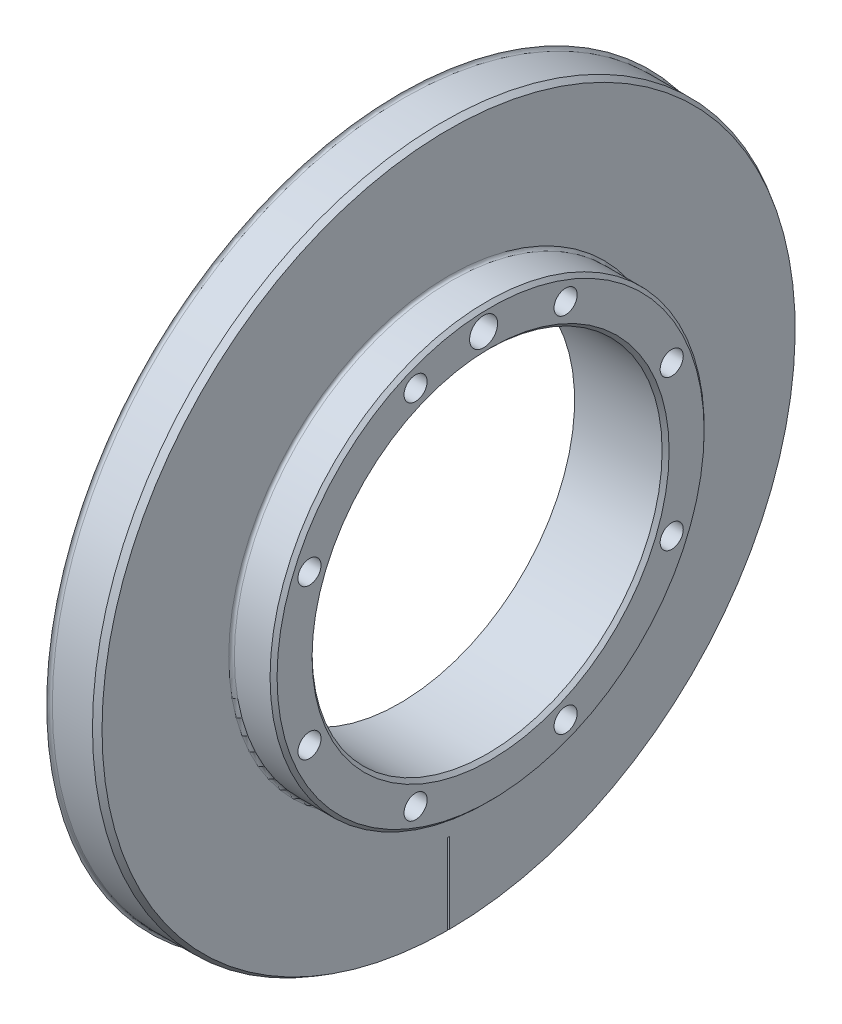
ISO-10303-21;
HEADER;
FILE_DESCRIPTION(('STEP AP214'),'2;1');
FILE_NAME('part.step','',(''),(''),'','','');
FILE_SCHEMA(('AUTOMOTIVE_DESIGN { 1 0 10303 214 1 1 1 1 }'));
ENDSEC;
DATA;
#1=APPLICATION_CONTEXT('core data for automotive mechanical design processes');
#2=APPLICATION_PROTOCOL_DEFINITION('international standard','automotive_design',2000,#1);
#3=PRODUCT_CONTEXT('',#1,'mechanical');
#4=PRODUCT('Part','Part','',(#3));
#5=PRODUCT_RELATED_PRODUCT_CATEGORY('part','',(#4));
#6=PRODUCT_DEFINITION_FORMATION('','',#4);
#7=PRODUCT_DEFINITION_CONTEXT('part definition',#1,'design');
#8=PRODUCT_DEFINITION('design','',#6,#7);
#9=PRODUCT_DEFINITION_SHAPE('','',#8);
#10=(LENGTH_UNIT() NAMED_UNIT(*) SI_UNIT(.MILLI.,.METRE.));
#11=(NAMED_UNIT(*) PLANE_ANGLE_UNIT() SI_UNIT($,.RADIAN.));
#12=(NAMED_UNIT(*) SI_UNIT($,.STERADIAN.) SOLID_ANGLE_UNIT());
#13=UNCERTAINTY_MEASURE_WITH_UNIT(LENGTH_MEASURE(1.E-05),#10,'distance_accuracy_value','');
#14=(GEOMETRIC_REPRESENTATION_CONTEXT(3) GLOBAL_UNCERTAINTY_ASSIGNED_CONTEXT((#13)) GLOBAL_UNIT_ASSIGNED_CONTEXT((#10,
#11,#12)) REPRESENTATION_CONTEXT('',''));
#15=CARTESIAN_POINT('',(0.,0.,0.));
#16=DIRECTION('',(0.,0.,1.));
#17=DIRECTION('',(1.,0.,0.));
#18=AXIS2_PLACEMENT_3D('',#15,#16,#17);
#19=CARTESIAN_POINT('',(1038.00000000103,1493.00000000012,1.00000000000006));
#20=DIRECTION('',(1.,0.,0.));
#21=DIRECTION('',(0.,0.,-1.));
#22=AXIS2_PLACEMENT_3D('',#19,#20,#21);
#23=CONICAL_SURFACE('',#22,1.79999999953284,1.02974425749221);
#24=CARTESIAN_POINT('',(1037.99999999991,1493.00000000012,1.00000000000006));
#25=DIRECTION('',(1.,0.,0.));
#26=DIRECTION('',(0.,0.,-1.));
#27=AXIS2_PLACEMENT_3D('',#24,#25,#26);
#28=CIRCLE('',#27,1.79999999999991);
#29=CARTESIAN_POINT('',(1037.99999999991,1493.00000000012,-0.799999999999848));
#30=VERTEX_POINT('',#29);
#31=EDGE_CURVE('E121',#30,#30,#28,.T.);
#32=ORIENTED_EDGE('',*,*,#31,.T.);
#33=EDGE_LOOP('',(#32));
#34=FACE_BOUND('',#33,.T.);
#35=CARTESIAN_POINT('',(1036.9184508842,1493.00000000008,1.00000000000006));
#36=VERTEX_POINT('',#35);
#37=VERTEX_LOOP('',#36);
#38=FACE_BOUND('',#37,.T.);
#39=ADVANCED_FACE('F17',(#34,#38),#23,.F.);
#40=CARTESIAN_POINT('',(1036.51437343015,1493.00000000012,1.00000000000006));
#41=DIRECTION('',(1.,0.,0.));
#42=DIRECTION('',(0.,0.,-1.));
#43=AXIS2_PLACEMENT_3D('',#40,#41,#42);
#44=CYLINDRICAL_SURFACE('',#43,1.79999999999991);
#45=ORIENTED_EDGE('',*,*,#31,.F.);
#46=EDGE_LOOP('',(#45));
#47=FACE_BOUND('',#46,.T.);
#48=CARTESIAN_POINT('',(1038.99999999991,1493.00000000012,1.00000000000006));
#49=DIRECTION('',(1.,0.,0.));
#50=DIRECTION('',(0.,0.,-1.));
#51=AXIS2_PLACEMENT_3D('',#48,#49,#50);
#52=CIRCLE('',#51,1.79999999999991);
#53=CARTESIAN_POINT('',(1038.99999999991,1493.00000000012,-0.799999999999848));
#54=VERTEX_POINT('',#53);
#55=EDGE_CURVE('E164',#54,#54,#52,.T.);
#56=ORIENTED_EDGE('',*,*,#55,.T.);
#57=EDGE_LOOP('',(#56));
#58=FACE_BOUND('',#57,.T.);
#59=ADVANCED_FACE('F318',(#47,#58),#44,.F.);
#60=CARTESIAN_POINT('',(945.00000000003,1426.99999999988,0.));
#61=DIRECTION('',(0.,1.,0.));
#62=DIRECTION('',(0.,0.,1.));
#63=AXIS2_PLACEMENT_3D('',#60,#61,#62);
#64=PLANE('',#63);
#65=DIRECTION('',(-0.866025403784429,0.,0.500000000000017));
#66=VECTOR('',#65,1.);
#67=CARTESIAN_POINT('',(1038.99999999991,1426.99999999988,-0.14433756729744));
#68=LINE('',#67,#66);
#69=CARTESIAN_POINT('',(1038.75000000012,1426.99999999988,-9.87854998178485E-11));
#70=VERTEX_POINT('',#69);
#71=CARTESIAN_POINT('',(1038.99999999991,1426.99999999988,-0.14433756729744));
#72=VERTEX_POINT('',#71);
#73=EDGE_CURVE('E112',#70,#72,#68,.F.);
#74=ORIENTED_EDGE('',*,*,#73,.T.);
#75=DIRECTION('',(0.,0.,1.));
#76=VECTOR('',#75,1.);
#77=CARTESIAN_POINT('',(1038.99999999991,1426.99999999988,0.));
#78=LINE('',#77,#76);
#79=CARTESIAN_POINT('',(1038.99999999992,1426.99999999988,0.144337567278896));
#80=VERTEX_POINT('',#79);
#81=EDGE_CURVE('E166',#72,#80,#78,.T.);
#82=ORIENTED_EDGE('',*,*,#81,.T.);
#83=DIRECTION('',(0.866025403784429,0.,0.500000000000017));
#84=VECTOR('',#83,1.);
#85=CARTESIAN_POINT('',(1038.75000000004,1426.99999999988,0.));
#86=LINE('',#85,#84);
#87=EDGE_CURVE('E109',#80,#70,#86,.F.);
#88=ORIENTED_EDGE('',*,*,#87,.T.);
#89=EDGE_LOOP('',(#74,#82,#88));
#90=FACE_BOUND('',#89,.T.);
#91=ADVANCED_FACE('F316',(#90),#64,.F.);
#92=CARTESIAN_POINT('',(1038.75000000004,1426.99999999988,0.));
#93=DIRECTION('',(-0.500000000000017,0.,0.866025403784429));
#94=DIRECTION('',(0.866025403784429,0.,0.500000000000017));
#95=AXIS2_PLACEMENT_3D('',#92,#93,#94);
#96=PLANE('',#95);
#97=DIRECTION('',(0.,1.,0.));
#98=VECTOR('',#97,1.);
#99=CARTESIAN_POINT('',(1038.75000000016,1426.99999999988,-1.48180404578591E-10));
#100=LINE('',#99,#98);
#101=CARTESIAN_POINT('',(1038.74999975354,1415.35566229019,1.64934703252532E-08));
#102=VERTEX_POINT('',#101);
#103=EDGE_CURVE('E100',#102,#70,#100,.T.);
#104=ORIENTED_EDGE('',*,*,#103,.T.);
#105=ORIENTED_EDGE('',*,*,#87,.F.);
#106=DIRECTION('',(0.,1.,0.));
#107=VECTOR('',#106,1.);
#108=CARTESIAN_POINT('',(1038.99999999991,1464.99999999998,0.144337567297364));
#109=LINE('',#108,#107);
#110=CARTESIAN_POINT('',(1039.00000000012,1415.50021043778,0.144337567318507));
#111=VERTEX_POINT('',#110);
#112=EDGE_CURVE('E108',#80,#111,#109,.F.);
#113=ORIENTED_EDGE('',*,*,#112,.T.);
#114=CARTESIAN_POINT('',(1038.74999994207,1415.35566239901,-3.34663578536975E-08));
#115=CARTESIAN_POINT('',(1038.79167879641,1415.37972565586,0.0240632643035077));
#116=CARTESIAN_POINT('',(1038.83335156174,1415.40380295418,0.048123046587439));
#117=CARTESIAN_POINT('',(1038.91668491442,1415.45198563376,0.0962355801894317));
#118=CARTESIAN_POINT('',(1038.95834550176,1415.47609101503,0.120288331507491));
#119=CARTESIAN_POINT('',(1039.00000000011,1415.50021043777,0.144337567339615));
#120=B_SPLINE_CURVE_WITH_KNOTS('',3,(#114,#115,#116,#117,#118,#119),.UNSPECIFIED.,.F.,.F.,(4,2,
4),(0.,0.161421433201902,0.322842866444055),.UNSPECIFIED.);
#121=EDGE_CURVE('E92',#102,#111,#120,.T.);
#122=ORIENTED_EDGE('',*,*,#121,.F.);
#123=EDGE_LOOP('',(#104,#105,#113,#122));
#124=FACE_BOUND('',#123,.T.);
#125=ADVANCED_FACE('F104',(#124),#96,.F.);
#126=CARTESIAN_POINT('',(1038.99999999991,1426.99999999988,-0.14433756729744));
#127=DIRECTION('',(-0.500000000000017,0.,-0.866025403784429));
#128=DIRECTION('',(-0.866025403784429,0.,0.500000000000017));
#129=AXIS2_PLACEMENT_3D('',#126,#127,#128);
#130=PLANE('',#129);
#131=ORIENTED_EDGE('',*,*,#103,.F.);
#132=CARTESIAN_POINT('',(1038.99999999998,1415.50021043785,-0.144337567463763));
#133=CARTESIAN_POINT('',(1038.9583455017,1415.47609101508,-0.120288331604589));
#134=CARTESIAN_POINT('',(1038.9166849144,1415.4519856338,-0.0962355802717079));
#135=CARTESIAN_POINT('',(1038.83335156178,1415.40380295421,-0.0481230466644701));
#136=CARTESIAN_POINT('',(1038.79167879646,1415.3797256559,-0.0240632643901151));
#137=CARTESIAN_POINT('',(1038.74999994213,1415.35566239907,3.33579455756654E-08));
#138=B_SPLINE_CURVE_WITH_KNOTS('',3,(#132,#133,#134,#135,#136,#137),.UNSPECIFIED.,.F.,.F.,(4,2,
4),(0.,0.161421433177669,0.322842866315485),.UNSPECIFIED.);
#139=CARTESIAN_POINT('',(1039.00000000008,1415.50021043778,-0.144337567343978));
#140=VERTEX_POINT('',#139);
#141=EDGE_CURVE('E89',#140,#102,#138,.T.);
#142=ORIENTED_EDGE('',*,*,#141,.F.);
#143=DIRECTION('',(0.,1.,0.));
#144=VECTOR('',#143,1.);
#145=CARTESIAN_POINT('',(1038.99999999991,1464.99999999998,-0.14433756729744));
#146=LINE('',#145,#144);
#147=EDGE_CURVE('E261',#140,#72,#146,.T.);
#148=ORIENTED_EDGE('',*,*,#147,.T.);
#149=ORIENTED_EDGE('',*,*,#73,.F.);
#150=EDGE_LOOP('',(#131,#142,#148,#149));
#151=FACE_BOUND('',#150,.T.);
#152=ADVANCED_FACE('F111',(#151),#130,.F.);
#153=CARTESIAN_POINT('',(1039.40000000001,1464.99999999998,0.));
#154=DIRECTION('',(-1.,0.,0.));
#155=DIRECTION('',(0.,0.999975174771761,-0.00704626427169272));
#156=AXIS2_PLACEMENT_3D('',#153,#154,#155);
#157=TOROIDAL_SURFACE('',#156,31.4000000000013,0.399999999999924);
#158=CARTESIAN_POINT('',(1039.40000000001,1464.99999999998,0.));
#159=DIRECTION('',(-1.,0.,0.));
#160=DIRECTION('',(0.,0.,1.));
#161=AXIS2_PLACEMENT_3D('',#158,#159,#160);
#162=CIRCLE('',#161,31.000000000003);
#163=CARTESIAN_POINT('',(1039.40000000001,1464.99999999998,31.000000000003));
#164=VERTEX_POINT('',#163);
#165=EDGE_CURVE('E114',#164,#164,#162,.F.);
#166=ORIENTED_EDGE('',*,*,#165,.F.);
#167=EDGE_LOOP('',(#166));
#168=FACE_BOUND('',#167,.T.);
#169=CARTESIAN_POINT('',(1039.00000000001,1464.99999999998,0.));
#170=DIRECTION('',(1.,0.,0.));
#171=DIRECTION('',(0.,1.,0.));
#172=AXIS2_PLACEMENT_3D('',#169,#170,#171);
#173=CIRCLE('',#172,31.3999999999761);
#174=CARTESIAN_POINT('',(1038.99999999997,1496.39999999997,0.));
#175=VERTEX_POINT('',#174);
#176=CARTESIAN_POINT('',(1038.99999999997,1433.6,0.));
#177=VERTEX_POINT('',#176);
#178=EDGE_CURVE('E254',#175,#177,#173,.T.);
#179=ORIENTED_EDGE('',*,*,#178,.T.);
#180=CARTESIAN_POINT('',(1039.00000000001,1464.99999999998,0.));
#181=DIRECTION('',(1.,0.,0.));
#182=DIRECTION('',(0.,-1.,0.));
#183=AXIS2_PLACEMENT_3D('',#180,#181,#182);
#184=CIRCLE('',#183,31.3999999999888);
#185=EDGE_CURVE('E252',#177,#175,#184,.T.);
#186=ORIENTED_EDGE('',*,*,#185,.T.);
#187=EDGE_LOOP('',(#179,#186));
#188=FACE_BOUND('',#187,.T.);
#189=ADVANCED_FACE('F293',(#168,#188),#157,.F.);
#190=CARTESIAN_POINT('',(1046.27500000004,1464.99999999998,0.));
#191=DIRECTION('',(-1.,0.,0.));
#192=DIRECTION('',(0.,0.,1.));
#193=AXIS2_PLACEMENT_3D('',#190,#191,#192);
#194=CYLINDRICAL_SURFACE('',#193,31.000000000003);
#195=CARTESIAN_POINT('',(1044.49999999978,1464.99999999998,0.));
#196=DIRECTION('',(-1.,0.,0.));
#197=DIRECTION('',(0.,0.,1.));
#198=AXIS2_PLACEMENT_3D('',#195,#196,#197);
#199=CIRCLE('',#198,30.999999999766);
#200=CARTESIAN_POINT('',(1044.49999999978,1464.99999999998,30.999999999766));
#201=VERTEX_POINT('',#200);
#202=EDGE_CURVE('E257',#201,#201,#199,.F.);
#203=ORIENTED_EDGE('',*,*,#202,.F.);
#204=EDGE_LOOP('',(#203));
#205=FACE_BOUND('',#204,.T.);
#206=ORIENTED_EDGE('',*,*,#165,.T.);
#207=EDGE_LOOP('',(#206));
#208=FACE_BOUND('',#207,.T.);
#209=ADVANCED_FACE('F297',(#205,#208),#194,.T.);
#210=CARTESIAN_POINT('',(1033.00000000081,1490.86862691033,-10.7151361062229));
#211=DIRECTION('',(1.,0.,0.));
#212=DIRECTION('',(0.,0.,-1.));
#213=AXIS2_PLACEMENT_3D('',#210,#211,#212);
#214=CONICAL_SURFACE('',#213,1.64999999933113,1.02974425745125);
#215=CARTESIAN_POINT('',(1032.99999999993,1490.86862691033,-10.7151361062229));
#216=DIRECTION('',(1.,0.,0.));
#217=DIRECTION('',(0.,0.,-1.));
#218=AXIS2_PLACEMENT_3D('',#215,#216,#217);
#219=CIRCLE('',#218,1.65);
#220=CARTESIAN_POINT('',(1032.99999999993,1490.86862691033,-12.3651361062229));
#221=VERTEX_POINT('',#220);
#222=EDGE_CURVE('E259',#221,#221,#219,.T.);
#223=ORIENTED_EDGE('',*,*,#222,.T.);
#224=EDGE_LOOP('',(#223));
#225=FACE_BOUND('',#224,.T.);
#226=CARTESIAN_POINT('',(1032.00857997714,1490.86862691018,-10.7151361062229));
#227=VERTEX_POINT('',#226);
#228=VERTEX_LOOP('',#227);
#229=FACE_BOUND('',#228,.T.);
#230=ADVANCED_FACE('F421',(#225,#229),#214,.F.);
#231=CARTESIAN_POINT('',(1033.0000000007,1475.71513610612,-25.8686269103186));
#232=DIRECTION('',(1.,0.,0.));
#233=DIRECTION('',(0.,0.,-1.));
#234=AXIS2_PLACEMENT_3D('',#231,#232,#233);
#235=CONICAL_SURFACE('',#234,1.64999999929821,1.02974425732286);
#236=CARTESIAN_POINT('',(1032.99999999993,1475.71513610612,-25.8686269103186));
#237=DIRECTION('',(1.,0.,0.));
#238=DIRECTION('',(0.,0.,-1.));
#239=AXIS2_PLACEMENT_3D('',#236,#237,#238);
#240=CIRCLE('',#239,1.65);
#241=CARTESIAN_POINT('',(1032.99999999993,1475.71513610612,-27.5186269103186));
#242=VERTEX_POINT('',#241);
#243=EDGE_CURVE('E286',#242,#242,#240,.T.);
#244=ORIENTED_EDGE('',*,*,#243,.T.);
#245=EDGE_LOOP('',(#244));
#246=FACE_BOUND('',#245,.T.);
#247=CARTESIAN_POINT('',(1032.008579977,1475.71513610612,-25.8686269103186));
#248=VERTEX_POINT('',#247);
#249=VERTEX_LOOP('',#248);
#250=FACE_BOUND('',#249,.T.);
#251=ADVANCED_FACE('F427',(#246,#250),#235,.F.);
#252=CARTESIAN_POINT('',(1033.00000000081,1454.28486389385,-25.8686269103186));
#253=DIRECTION('',(1.,0.,0.));
#254=DIRECTION('',(0.,0.,-1.));
#255=AXIS2_PLACEMENT_3D('',#252,#253,#254);
#256=CONICAL_SURFACE('',#255,1.64999999924981,1.02974425735201);
#257=CARTESIAN_POINT('',(1032.99999999993,1454.28486389385,-25.8686269103186));
#258=DIRECTION('',(1.,0.,0.));
#259=DIRECTION('',(0.,0.,-1.));
#260=AXIS2_PLACEMENT_3D('',#257,#258,#259);
#261=CIRCLE('',#260,1.65);
#262=CARTESIAN_POINT('',(1032.99999999993,1454.28486389385,-27.5186269103186));
#263=VERTEX_POINT('',#262);
#264=EDGE_CURVE('E283',#263,#263,#261,.T.);
#265=ORIENTED_EDGE('',*,*,#264,.T.);
#266=EDGE_LOOP('',(#265));
#267=FACE_BOUND('',#266,.T.);
#268=CARTESIAN_POINT('',(1032.00857997712,1454.28486389385,-25.8686269101247));
#269=VERTEX_POINT('',#268);
#270=VERTEX_LOOP('',#269);
#271=FACE_BOUND('',#270,.T.);
#272=ADVANCED_FACE('F432',(#267,#271),#256,.F.);
#273=CARTESIAN_POINT('',(1033.00000000092,1439.13137308964,-10.7151361062229));
#274=DIRECTION('',(1.,0.,0.));
#275=DIRECTION('',(0.,0.,-1.));
#276=AXIS2_PLACEMENT_3D('',#273,#274,#275);
#277=CONICAL_SURFACE('',#276,1.6499999995087,1.02974425748164);
#278=CARTESIAN_POINT('',(1032.99999999993,1439.13137308964,-10.7151361062229));
#279=DIRECTION('',(1.,0.,0.));
#280=DIRECTION('',(0.,0.,-1.));
#281=AXIS2_PLACEMENT_3D('',#278,#279,#280);
#282=CIRCLE('',#281,1.65);
#283=CARTESIAN_POINT('',(1032.99999999993,1439.13137308964,-12.3651361062229));
#284=VERTEX_POINT('',#283);
#285=EDGE_CURVE('E280',#284,#284,#282,.T.);
#286=ORIENTED_EDGE('',*,*,#285,.T.);
#287=EDGE_LOOP('',(#286));
#288=FACE_BOUND('',#287,.T.);
#289=CARTESIAN_POINT('',(1032.00857997717,1439.13137308964,-10.7151361062229));
#290=VERTEX_POINT('',#289);
#291=VERTEX_LOOP('',#290);
#292=FACE_BOUND('',#291,.T.);
#293=ADVANCED_FACE('F439',(#288,#292),#277,.F.);
#294=CARTESIAN_POINT('',(1033.00000000081,1439.13137308964,10.7151361062229));
#295=DIRECTION('',(1.,0.,0.));
#296=DIRECTION('',(0.,0.,-1.));
#297=AXIS2_PLACEMENT_3D('',#294,#295,#296);
#298=CONICAL_SURFACE('',#297,1.64999999934512,1.02974425740301);
#299=CARTESIAN_POINT('',(1032.99999999993,1439.13137308964,10.7151361062229));
#300=DIRECTION('',(1.,0.,0.));
#301=DIRECTION('',(0.,0.,-1.));
#302=AXIS2_PLACEMENT_3D('',#299,#300,#301);
#303=CIRCLE('',#302,1.65);
#304=CARTESIAN_POINT('',(1032.99999999993,1439.13137308964,9.0651361062229));
#305=VERTEX_POINT('',#304);
#306=EDGE_CURVE('E277',#305,#305,#303,.T.);
#307=ORIENTED_EDGE('',*,*,#306,.T.);
#308=EDGE_LOOP('',(#307));
#309=FACE_BOUND('',#308,.T.);
#310=CARTESIAN_POINT('',(1032.00857997709,1439.13137308979,10.7151361062229));
#311=VERTEX_POINT('',#310);
#312=VERTEX_LOOP('',#311);
#313=FACE_BOUND('',#312,.T.);
#314=ADVANCED_FACE('F443',(#309,#313),#298,.F.);
#315=CARTESIAN_POINT('',(1033.00000000075,1454.28486389385,25.8686269103186));
#316=DIRECTION('',(1.,0.,0.));
#317=DIRECTION('',(0.,0.,-1.));
#318=AXIS2_PLACEMENT_3D('',#315,#316,#317);
#319=CONICAL_SURFACE('',#318,1.64999999926791,1.02974425729334);
#320=CARTESIAN_POINT('',(1032.99999999993,1454.28486389385,25.8686269103186));
#321=DIRECTION('',(1.,0.,0.));
#322=DIRECTION('',(0.,0.,-1.));
#323=AXIS2_PLACEMENT_3D('',#320,#321,#322);
#324=CIRCLE('',#323,1.65);
#325=CARTESIAN_POINT('',(1032.99999999993,1454.28486389385,24.2186269103186));
#326=VERTEX_POINT('',#325);
#327=EDGE_CURVE('E274',#326,#326,#324,.T.);
#328=ORIENTED_EDGE('',*,*,#327,.T.);
#329=EDGE_LOOP('',(#328));
#330=FACE_BOUND('',#329,.T.);
#331=CARTESIAN_POINT('',(1032.008579977,1454.28486389385,25.8686269103186));
#332=VERTEX_POINT('',#331);
#333=VERTEX_LOOP('',#332);
#334=FACE_BOUND('',#333,.T.);
#335=ADVANCED_FACE('F447',(#330,#334),#319,.F.);
#336=CARTESIAN_POINT('',(1033.00000000081,1475.71513610612,25.8686269103186));
#337=DIRECTION('',(1.,0.,0.));
#338=DIRECTION('',(0.,0.,-1.));
#339=AXIS2_PLACEMENT_3D('',#336,#337,#338);
#340=CONICAL_SURFACE('',#339,1.64999999924981,1.02974425735201);
#341=CARTESIAN_POINT('',(1032.99999999993,1475.71513610612,25.8686269103186));
#342=DIRECTION('',(1.,0.,0.));
#343=DIRECTION('',(0.,0.,-1.));
#344=AXIS2_PLACEMENT_3D('',#341,#342,#343);
#345=CIRCLE('',#344,1.65);
#346=CARTESIAN_POINT('',(1032.99999999993,1475.71513610612,24.2186269103186));
#347=VERTEX_POINT('',#346);
#348=EDGE_CURVE('E271',#347,#347,#345,.T.);
#349=ORIENTED_EDGE('',*,*,#348,.T.);
#350=EDGE_LOOP('',(#349));
#351=FACE_BOUND('',#350,.T.);
#352=CARTESIAN_POINT('',(1032.00857997712,1475.71513610612,25.8686269101247));
#353=VERTEX_POINT('',#352);
#354=VERTEX_LOOP('',#353);
#355=FACE_BOUND('',#354,.T.);
#356=ADVANCED_FACE('F451',(#351,#355),#340,.F.);
#357=CARTESIAN_POINT('',(1033.00000000087,1490.86862691033,10.7151361062229));
#358=DIRECTION('',(1.,0.,0.));
#359=DIRECTION('',(0.,0.,-1.));
#360=AXIS2_PLACEMENT_3D('',#357,#358,#359);
#361=CONICAL_SURFACE('',#360,1.64999999941842,1.02974425748116);
#362=CARTESIAN_POINT('',(1032.99999999993,1490.86862691033,10.7151361062229));
#363=DIRECTION('',(1.,0.,0.));
#364=DIRECTION('',(0.,0.,-1.));
#365=AXIS2_PLACEMENT_3D('',#362,#363,#364);
#366=CIRCLE('',#365,1.65);
#367=CARTESIAN_POINT('',(1032.99999999993,1490.86862691033,9.0651361062229));
#368=VERTEX_POINT('',#367);
#369=EDGE_CURVE('E163',#368,#368,#366,.T.);
#370=ORIENTED_EDGE('',*,*,#369,.T.);
#371=EDGE_LOOP('',(#370));
#372=FACE_BOUND('',#371,.T.);
#373=CARTESIAN_POINT('',(1032.00857997717,1490.86862691033,10.7151361062229));
#374=VERTEX_POINT('',#373);
#375=VERTEX_LOOP('',#374);
#376=FACE_BOUND('',#375,.T.);
#377=ADVANCED_FACE('F454',(#372,#376),#361,.F.);
#378=CARTESIAN_POINT('',(1038.99999999991,1493.00000000012,1.00000000000006));
#379=DIRECTION('',(-1.,0.,0.));
#380=DIRECTION('',(0.,0.,1.));
#381=AXIS2_PLACEMENT_3D('',#378,#379,#380);
#382=PLANE('',#381);
#383=ORIENTED_EDGE('',*,*,#55,.F.);
#384=EDGE_LOOP('',(#383));
#385=FACE_BOUND('',#384,.T.);
#386=CARTESIAN_POINT('',(1038.99999999991,1493.00000000012,1.00000000000006));
#387=DIRECTION('',(-1.,0.,0.));
#388=DIRECTION('',(0.,0.,1.));
#389=AXIS2_PLACEMENT_3D('',#386,#387,#388);
#390=CIRCLE('',#389,1.99999999999987);
#391=CARTESIAN_POINT('',(1038.99999999991,1493.00000000012,2.99999999999994));
#392=VERTEX_POINT('',#391);
#393=EDGE_CURVE('E160',#392,#392,#390,.F.);
#394=ORIENTED_EDGE('',*,*,#393,.T.);
#395=EDGE_LOOP('',(#394));
#396=FACE_BOUND('',#395,.T.);
#397=ADVANCED_FACE('F231',(#385,#396),#382,.F.);
#398=CARTESIAN_POINT('',(1038.99999999991,1464.99999999998,0.));
#399=DIRECTION('',(-1.,0.,0.));
#400=DIRECTION('',(0.,0.,1.));
#401=AXIS2_PLACEMENT_3D('',#398,#399,#400);
#402=PLANE('',#401);
#403=ORIENTED_EDGE('',*,*,#178,.F.);
#404=ORIENTED_EDGE('',*,*,#185,.F.);
#405=EDGE_LOOP('',(#403,#404));
#406=FACE_BOUND('',#405,.T.);
#407=CARTESIAN_POINT('',(1039.00000000008,1464.99999999998,-5.27355936696949E-13));
#408=DIRECTION('',(-1.,0.,0.));
#409=DIRECTION('',(0.,0.,1.));
#410=AXIS2_PLACEMENT_3D('',#407,#408,#409);
#411=CIRCLE('',#410,49.500000000356);
#412=EDGE_CURVE('E95',#111,#140,#411,.T.);
#413=ORIENTED_EDGE('',*,*,#412,.F.);
#414=ORIENTED_EDGE('',*,*,#112,.F.);
#415=ORIENTED_EDGE('',*,*,#81,.F.);
#416=ORIENTED_EDGE('',*,*,#147,.F.);
#417=EDGE_LOOP('',(#413,#414,#415,#416));
#418=FACE_BOUND('',#417,.T.);
#419=ADVANCED_FACE('F226',(#406,#418),#402,.F.);
#420=CARTESIAN_POINT('',(1044.49999999978,1464.99999999998,0.));
#421=DIRECTION('',(-1.,0.,0.));
#422=DIRECTION('',(0.,0.,1.));
#423=AXIS2_PLACEMENT_3D('',#420,#421,#422);
#424=CONICAL_SURFACE('',#423,30.999999999766,0.785398162500017);
#425=CARTESIAN_POINT('',(1045.0000000001,1464.99999999998,0.));
#426=DIRECTION('',(-1.,0.,0.));
#427=DIRECTION('',(0.,0.,1.));
#428=AXIS2_PLACEMENT_3D('',#425,#426,#427);
#429=CIRCLE('',#428,30.5000000003437);
#430=CARTESIAN_POINT('',(1045.0000000001,1464.99999999998,30.5000000003437));
#431=VERTEX_POINT('',#430);
#432=EDGE_CURVE('E156',#431,#431,#429,.T.);
#433=ORIENTED_EDGE('',*,*,#432,.T.);
#434=EDGE_LOOP('',(#433));
#435=FACE_BOUND('',#434,.T.);
#436=ORIENTED_EDGE('',*,*,#202,.T.);
#437=EDGE_LOOP('',(#436));
#438=FACE_BOUND('',#437,.T.);
#439=ADVANCED_FACE('F222',(#435,#438),#424,.T.);
#440=CARTESIAN_POINT('',(1031.35900897763,1490.86862691033,-10.7151361062229));
#441=DIRECTION('',(1.,0.,0.));
#442=DIRECTION('',(0.,0.,-1.));
#443=AXIS2_PLACEMENT_3D('',#440,#441,#442);
#444=CYLINDRICAL_SURFACE('',#443,1.65);
#445=ORIENTED_EDGE('',*,*,#222,.F.);
#446=EDGE_LOOP('',(#445));
#447=FACE_BOUND('',#446,.T.);
#448=CARTESIAN_POINT('',(1044.99999999988,1490.86862691033,-10.7151361062229));
#449=DIRECTION('',(1.,0.,0.));
#450=DIRECTION('',(0.,0.,-1.));
#451=AXIS2_PLACEMENT_3D('',#448,#449,#450);
#452=CIRCLE('',#451,1.65);
#453=CARTESIAN_POINT('',(1044.99999999988,1490.86862691033,-12.3651361062229));
#454=VERTEX_POINT('',#453);
#455=EDGE_CURVE('E153',#454,#454,#452,.T.);
#456=ORIENTED_EDGE('',*,*,#455,.T.);
#457=EDGE_LOOP('',(#456));
#458=FACE_BOUND('',#457,.T.);
#459=ADVANCED_FACE('F218',(#447,#458),#444,.F.);
#460=CARTESIAN_POINT('',(1031.35900897763,1475.71513610612,-25.8686269103186));
#461=DIRECTION('',(1.,0.,0.));
#462=DIRECTION('',(0.,0.,-1.));
#463=AXIS2_PLACEMENT_3D('',#460,#461,#462);
#464=CYLINDRICAL_SURFACE('',#463,1.65);
#465=ORIENTED_EDGE('',*,*,#243,.F.);
#466=EDGE_LOOP('',(#465));
#467=FACE_BOUND('',#466,.T.);
#468=CARTESIAN_POINT('',(1044.99999999988,1475.71513610612,-25.8686269103186));
#469=DIRECTION('',(1.,0.,0.));
#470=DIRECTION('',(0.,0.,-1.));
#471=AXIS2_PLACEMENT_3D('',#468,#469,#470);
#472=CIRCLE('',#471,1.65);
#473=CARTESIAN_POINT('',(1044.99999999988,1475.71513610612,-27.5186269103186));
#474=VERTEX_POINT('',#473);
#475=EDGE_CURVE('E150',#474,#474,#472,.T.);
#476=ORIENTED_EDGE('',*,*,#475,.T.);
#477=EDGE_LOOP('',(#476));
#478=FACE_BOUND('',#477,.T.);
#479=ADVANCED_FACE('F214',(#467,#478),#464,.F.);
#480=CARTESIAN_POINT('',(1031.35900897763,1454.28486389385,-25.8686269103186));
#481=DIRECTION('',(1.,0.,0.));
#482=DIRECTION('',(0.,0.,-1.));
#483=AXIS2_PLACEMENT_3D('',#480,#481,#482);
#484=CYLINDRICAL_SURFACE('',#483,1.65);
#485=ORIENTED_EDGE('',*,*,#264,.F.);
#486=EDGE_LOOP('',(#485));
#487=FACE_BOUND('',#486,.T.);
#488=CARTESIAN_POINT('',(1044.99999999988,1454.28486389385,-25.8686269103186));
#489=DIRECTION('',(1.,0.,0.));
#490=DIRECTION('',(0.,0.,-1.));
#491=AXIS2_PLACEMENT_3D('',#488,#489,#490);
#492=CIRCLE('',#491,1.65);
#493=CARTESIAN_POINT('',(1044.99999999988,1454.28486389385,-27.5186269103186));
#494=VERTEX_POINT('',#493);
#495=EDGE_CURVE('E147',#494,#494,#492,.T.);
#496=ORIENTED_EDGE('',*,*,#495,.T.);
#497=EDGE_LOOP('',(#496));
#498=FACE_BOUND('',#497,.T.);
#499=ADVANCED_FACE('F210',(#487,#498),#484,.F.);
#500=CARTESIAN_POINT('',(1031.35900897763,1439.13137308964,-10.7151361062229));
#501=DIRECTION('',(1.,0.,0.));
#502=DIRECTION('',(0.,0.,-1.));
#503=AXIS2_PLACEMENT_3D('',#500,#501,#502);
#504=CYLINDRICAL_SURFACE('',#503,1.65);
#505=ORIENTED_EDGE('',*,*,#285,.F.);
#506=EDGE_LOOP('',(#505));
#507=FACE_BOUND('',#506,.T.);
#508=CARTESIAN_POINT('',(1044.99999999988,1439.13137308964,-10.7151361062229));
#509=DIRECTION('',(1.,0.,0.));
#510=DIRECTION('',(0.,0.,-1.));
#511=AXIS2_PLACEMENT_3D('',#508,#509,#510);
#512=CIRCLE('',#511,1.65);
#513=CARTESIAN_POINT('',(1044.99999999988,1439.13137308964,-12.3651361062229));
#514=VERTEX_POINT('',#513);
#515=EDGE_CURVE('E144',#514,#514,#512,.T.);
#516=ORIENTED_EDGE('',*,*,#515,.T.);
#517=EDGE_LOOP('',(#516));
#518=FACE_BOUND('',#517,.T.);
#519=ADVANCED_FACE('F206',(#507,#518),#504,.F.);
#520=CARTESIAN_POINT('',(1031.35900897763,1439.13137308964,10.7151361062229));
#521=DIRECTION('',(1.,0.,0.));
#522=DIRECTION('',(0.,0.,-1.));
#523=AXIS2_PLACEMENT_3D('',#520,#521,#522);
#524=CYLINDRICAL_SURFACE('',#523,1.65);
#525=ORIENTED_EDGE('',*,*,#306,.F.);
#526=EDGE_LOOP('',(#525));
#527=FACE_BOUND('',#526,.T.);
#528=CARTESIAN_POINT('',(1044.99999999988,1439.13137308964,10.7151361062229));
#529=DIRECTION('',(1.,0.,0.));
#530=DIRECTION('',(0.,0.,-1.));
#531=AXIS2_PLACEMENT_3D('',#528,#529,#530);
#532=CIRCLE('',#531,1.65);
#533=CARTESIAN_POINT('',(1044.99999999988,1439.13137308964,9.0651361062229));
#534=VERTEX_POINT('',#533);
#535=EDGE_CURVE('E141',#534,#534,#532,.T.);
#536=ORIENTED_EDGE('',*,*,#535,.T.);
#537=EDGE_LOOP('',(#536));
#538=FACE_BOUND('',#537,.T.);
#539=ADVANCED_FACE('F202',(#527,#538),#524,.F.);
#540=CARTESIAN_POINT('',(1031.35900897763,1454.28486389385,25.8686269103186));
#541=DIRECTION('',(1.,0.,0.));
#542=DIRECTION('',(0.,0.,-1.));
#543=AXIS2_PLACEMENT_3D('',#540,#541,#542);
#544=CYLINDRICAL_SURFACE('',#543,1.65);
#545=ORIENTED_EDGE('',*,*,#327,.F.);
#546=EDGE_LOOP('',(#545));
#547=FACE_BOUND('',#546,.T.);
#548=CARTESIAN_POINT('',(1044.99999999988,1454.28486389385,25.8686269103186));
#549=DIRECTION('',(1.,0.,0.));
#550=DIRECTION('',(0.,0.,-1.));
#551=AXIS2_PLACEMENT_3D('',#548,#549,#550);
#552=CIRCLE('',#551,1.65);
#553=CARTESIAN_POINT('',(1044.99999999988,1454.28486389385,24.2186269103186));
#554=VERTEX_POINT('',#553);
#555=EDGE_CURVE('E138',#554,#554,#552,.T.);
#556=ORIENTED_EDGE('',*,*,#555,.T.);
#557=EDGE_LOOP('',(#556));
#558=FACE_BOUND('',#557,.T.);
#559=ADVANCED_FACE('F198',(#547,#558),#544,.F.);
#560=CARTESIAN_POINT('',(1031.35900897763,1475.71513610612,25.8686269103186));
#561=DIRECTION('',(1.,0.,0.));
#562=DIRECTION('',(0.,0.,-1.));
#563=AXIS2_PLACEMENT_3D('',#560,#561,#562);
#564=CYLINDRICAL_SURFACE('',#563,1.65);
#565=ORIENTED_EDGE('',*,*,#348,.F.);
#566=EDGE_LOOP('',(#565));
#567=FACE_BOUND('',#566,.T.);
#568=CARTESIAN_POINT('',(1044.99999999988,1475.71513610612,25.8686269103186));
#569=DIRECTION('',(1.,0.,0.));
#570=DIRECTION('',(0.,0.,-1.));
#571=AXIS2_PLACEMENT_3D('',#568,#569,#570);
#572=CIRCLE('',#571,1.65);
#573=CARTESIAN_POINT('',(1044.99999999988,1475.71513610612,24.2186269103186));
#574=VERTEX_POINT('',#573);
#575=EDGE_CURVE('E135',#574,#574,#572,.T.);
#576=ORIENTED_EDGE('',*,*,#575,.T.);
#577=EDGE_LOOP('',(#576));
#578=FACE_BOUND('',#577,.T.);
#579=ADVANCED_FACE('F194',(#567,#578),#564,.F.);
#580=CARTESIAN_POINT('',(1031.35900897763,1490.86862691033,10.7151361062229));
#581=DIRECTION('',(1.,0.,0.));
#582=DIRECTION('',(0.,0.,-1.));
#583=AXIS2_PLACEMENT_3D('',#580,#581,#582);
#584=CYLINDRICAL_SURFACE('',#583,1.65);
#585=ORIENTED_EDGE('',*,*,#369,.F.);
#586=EDGE_LOOP('',(#585));
#587=FACE_BOUND('',#586,.T.);
#588=CARTESIAN_POINT('',(1044.99999999988,1490.86862691033,10.7151361062229));
#589=DIRECTION('',(1.,0.,0.));
#590=DIRECTION('',(0.,0.,-1.));
#591=AXIS2_PLACEMENT_3D('',#588,#589,#590);
#592=CIRCLE('',#591,1.65);
#593=CARTESIAN_POINT('',(1044.99999999988,1490.86862691033,9.0651361062229));
#594=VERTEX_POINT('',#593);
#595=EDGE_CURVE('E132',#594,#594,#592,.T.);
#596=ORIENTED_EDGE('',*,*,#595,.T.);
#597=EDGE_LOOP('',(#596));
#598=FACE_BOUND('',#597,.T.);
#599=ADVANCED_FACE('F190',(#587,#598),#584,.F.);
#600=CARTESIAN_POINT('',(1044.99999999988,1493.00000000012,1.00000000000006));
#601=DIRECTION('',(-1.,0.,0.));
#602=DIRECTION('',(0.,0.,1.));
#603=AXIS2_PLACEMENT_3D('',#600,#601,#602);
#604=CYLINDRICAL_SURFACE('',#603,1.99999999999987);
#605=ORIENTED_EDGE('',*,*,#393,.F.);
#606=EDGE_LOOP('',(#605));
#607=FACE_BOUND('',#606,.T.);
#608=CARTESIAN_POINT('',(1044.99999999988,1493.00000000012,1.00000000000006));
#609=DIRECTION('',(-1.,0.,0.));
#610=DIRECTION('',(0.,0.,1.));
#611=AXIS2_PLACEMENT_3D('',#608,#609,#610);
#612=CIRCLE('',#611,1.99999999999987);
#613=CARTESIAN_POINT('',(1044.99999999988,1493.00000000012,2.99999999999994));
#614=VERTEX_POINT('',#613);
#615=EDGE_CURVE('E129',#614,#614,#612,.F.);
#616=ORIENTED_EDGE('',*,*,#615,.T.);
#617=EDGE_LOOP('',(#616));
#618=FACE_BOUND('',#617,.T.);
#619=ADVANCED_FACE('F183',(#607,#618),#604,.F.);
#620=CARTESIAN_POINT('',(1038.13397459615,1464.99999999998,-5.27355936696949E-13));
#621=DIRECTION('',(-1.,0.,0.));
#622=DIRECTION('',(0.,0.,1.));
#623=AXIS2_PLACEMENT_3D('',#620,#621,#622);
#624=CONICAL_SURFACE('',#623,49.9999999997497,0.523598774999978);
#625=CARTESIAN_POINT('',(1038.13397459633,1464.99999999998,0.));
#626=DIRECTION('',(-1.,0.,0.));
#627=DIRECTION('',(0.,0.,1.));
#628=AXIS2_PLACEMENT_3D('',#625,#626,#627);
#629=CIRCLE('',#628,50.0000000000032);
#630=CARTESIAN_POINT('',(1038.13397459633,1464.99999999998,50.0000000000032));
#631=VERTEX_POINT('',#630);
#632=EDGE_CURVE('E128',#631,#631,#629,.T.);
#633=ORIENTED_EDGE('',*,*,#632,.F.);
#634=EDGE_LOOP('',(#633));
#635=FACE_BOUND('',#634,.T.);
#636=ORIENTED_EDGE('',*,*,#412,.T.);
#637=ORIENTED_EDGE('',*,*,#141,.T.);
#638=ORIENTED_EDGE('',*,*,#121,.T.);
#639=EDGE_LOOP('',(#636,#637,#638));
#640=FACE_BOUND('',#639,.T.);
#641=ADVANCED_FACE('F91',(#635,#640),#624,.T.);
#642=CARTESIAN_POINT('',(1044.99999999988,1464.99999999998,0.));
#643=DIRECTION('',(-1.,0.,0.));
#644=DIRECTION('',(0.,0.,1.));
#645=AXIS2_PLACEMENT_3D('',#642,#643,#644);
#646=PLANE('',#645);
#647=CARTESIAN_POINT('',(1045.00000000006,1464.99999999998,0.));
#648=DIRECTION('',(1.,0.,0.));
#649=DIRECTION('',(0.,0.,-1.));
#650=AXIS2_PLACEMENT_3D('',#647,#648,#649);
#651=CIRCLE('',#650,25.4999999997221);
#652=CARTESIAN_POINT('',(1045.00000000006,1464.99999999998,-25.4999999997221));
#653=VERTEX_POINT('',#652);
#654=EDGE_CURVE('E124',#653,#653,#651,.F.);
#655=ORIENTED_EDGE('',*,*,#654,.T.);
#656=EDGE_LOOP('',(#655));
#657=FACE_BOUND('',#656,.T.);
#658=ORIENTED_EDGE('',*,*,#615,.F.);
#659=EDGE_LOOP('',(#658));
#660=FACE_BOUND('',#659,.T.);
#661=ORIENTED_EDGE('',*,*,#595,.F.);
#662=EDGE_LOOP('',(#661));
#663=FACE_BOUND('',#662,.T.);
#664=ORIENTED_EDGE('',*,*,#575,.F.);
#665=EDGE_LOOP('',(#664));
#666=FACE_BOUND('',#665,.T.);
#667=ORIENTED_EDGE('',*,*,#555,.F.);
#668=EDGE_LOOP('',(#667));
#669=FACE_BOUND('',#668,.T.);
#670=ORIENTED_EDGE('',*,*,#535,.F.);
#671=EDGE_LOOP('',(#670));
#672=FACE_BOUND('',#671,.T.);
#673=ORIENTED_EDGE('',*,*,#515,.F.);
#674=EDGE_LOOP('',(#673));
#675=FACE_BOUND('',#674,.T.);
#676=ORIENTED_EDGE('',*,*,#495,.F.);
#677=EDGE_LOOP('',(#676));
#678=FACE_BOUND('',#677,.T.);
#679=ORIENTED_EDGE('',*,*,#475,.F.);
#680=EDGE_LOOP('',(#679));
#681=FACE_BOUND('',#680,.T.);
#682=ORIENTED_EDGE('',*,*,#455,.F.);
#683=EDGE_LOOP('',(#682));
#684=FACE_BOUND('',#683,.T.);
#685=ORIENTED_EDGE('',*,*,#432,.F.);
#686=EDGE_LOOP('',(#685));
#687=FACE_BOUND('',#686,.T.);
#688=ADVANCED_FACE('F182',(#657,#660,#663,#666,#669,#672,#675,#678,#681,#684,#687),#646,.F.);
#689=CARTESIAN_POINT('',(1046.27500000004,1464.99999999998,0.));
#690=DIRECTION('',(-1.,0.,0.));
#691=DIRECTION('',(0.,0.,1.));
#692=AXIS2_PLACEMENT_3D('',#689,#690,#691);
#693=CYLINDRICAL_SURFACE('',#692,50.0000000000032);
#694=ORIENTED_EDGE('',*,*,#632,.T.);
#695=EDGE_LOOP('',(#694));
#696=FACE_BOUND('',#695,.T.);
#697=CARTESIAN_POINT('',(1032.40000000004,1464.99999999998,0.));
#698=DIRECTION('',(-1.,0.,0.));
#699=DIRECTION('',(0.,0.999990457157958,-0.00436870610332283));
#700=AXIS2_PLACEMENT_3D('',#697,#698,#699);
#701=CIRCLE('',#700,50.0000000000016);
#702=CARTESIAN_POINT('',(1032.40000000004,1514.99952285788,-0.218435305166149));
#703=VERTEX_POINT('',#702);
#704=EDGE_CURVE('E127',#703,#703,#701,.F.);
#705=ORIENTED_EDGE('',*,*,#704,.T.);
#706=EDGE_LOOP('',(#705));
#707=FACE_BOUND('',#706,.T.);
#708=ADVANCED_FACE('F384',(#696,#707),#693,.T.);
#709=CARTESIAN_POINT('',(1045.00000000006,1464.99999999998,0.));
#710=DIRECTION('',(1.,0.,0.));
#711=DIRECTION('',(0.,0.,-1.));
#712=AXIS2_PLACEMENT_3D('',#709,#710,#711);
#713=CONICAL_SURFACE('',#712,25.4999999997221,0.785398162499996);
#714=CARTESIAN_POINT('',(1044.49999999989,1464.99999999998,0.));
#715=DIRECTION('',(-1.,0.,0.));
#716=DIRECTION('',(0.,0.,1.));
#717=AXIS2_PLACEMENT_3D('',#714,#715,#716);
#718=CIRCLE('',#717,24.9999999999991);
#719=CARTESIAN_POINT('',(1044.49999999989,1464.99999999998,24.9999999999991));
#720=VERTEX_POINT('',#719);
#721=EDGE_CURVE('E375',#720,#720,#718,.T.);
#722=ORIENTED_EDGE('',*,*,#721,.T.);
#723=EDGE_LOOP('',(#722));
#724=FACE_BOUND('',#723,.T.);
#725=ORIENTED_EDGE('',*,*,#654,.F.);
#726=EDGE_LOOP('',(#725));
#727=FACE_BOUND('',#726,.T.);
#728=ADVANCED_FACE('F360',(#724,#727),#713,.F.);
#729=CARTESIAN_POINT('',(1032.40000000004,1464.99999999998,0.));
#730=DIRECTION('',(-1.,0.,0.));
#731=DIRECTION('',(0.,0.999990457157958,-0.00436870610332283));
#732=AXIS2_PLACEMENT_3D('',#729,#730,#731);
#733=TOROIDAL_SURFACE('',#732,50.4000000000016,0.399999999999924);
#734=ORIENTED_EDGE('',*,*,#704,.F.);
#735=EDGE_LOOP('',(#734));
#736=FACE_BOUND('',#735,.T.);
#737=CARTESIAN_POINT('',(1032.00000000004,1464.99999999998,0.));
#738=DIRECTION('',(1.,0.,0.));
#739=DIRECTION('',(0.,1.,0.));
#740=AXIS2_PLACEMENT_3D('',#737,#738,#739);
#741=CIRCLE('',#740,50.3999999999001);
#742=CARTESIAN_POINT('',(1032.,1414.60000000005,0.));
#743=VERTEX_POINT('',#742);
#744=CARTESIAN_POINT('',(1032.,1515.39999999991,-1.67061477931281E-13));
#745=VERTEX_POINT('',#744);
#746=EDGE_CURVE('E374',#743,#745,#741,.F.);
#747=ORIENTED_EDGE('',*,*,#746,.F.);
#748=CARTESIAN_POINT('',(1032.00000000004,1464.99999999998,0.));
#749=DIRECTION('',(1.,0.,0.));
#750=DIRECTION('',(0.,-1.,0.));
#751=AXIS2_PLACEMENT_3D('',#748,#749,#750);
#752=CIRCLE('',#751,50.3999999999509);
#753=EDGE_CURVE('E28',#745,#743,#752,.F.);
#754=ORIENTED_EDGE('',*,*,#753,.F.);
#755=EDGE_LOOP('',(#747,#754));
#756=FACE_BOUND('',#755,.T.);
#757=ADVANCED_FACE('F334',(#736,#756),#733,.F.);
#758=CARTESIAN_POINT('',(1046.27500000004,1464.99999999998,0.));
#759=DIRECTION('',(-1.,0.,0.));
#760=DIRECTION('',(0.,0.,1.));
#761=AXIS2_PLACEMENT_3D('',#758,#759,#760);
#762=CYLINDRICAL_SURFACE('',#761,24.9999999999991);
#763=ORIENTED_EDGE('',*,*,#721,.F.);
#764=EDGE_LOOP('',(#763));
#765=FACE_BOUND('',#764,.T.);
#766=CARTESIAN_POINT('',(1031.99999999994,1464.99999999998,0.));
#767=DIRECTION('',(-1.,0.,0.));
#768=DIRECTION('',(0.,0.,1.));
#769=AXIS2_PLACEMENT_3D('',#766,#767,#768);
#770=CIRCLE('',#769,24.9999999999991);
#771=CARTESIAN_POINT('',(1031.99999999994,1464.99999999998,24.9999999999991));
#772=VERTEX_POINT('',#771);
#773=EDGE_CURVE('E11',#772,#772,#770,.F.);
#774=ORIENTED_EDGE('',*,*,#773,.F.);
#775=EDGE_LOOP('',(#774));
#776=FACE_BOUND('',#775,.T.);
#777=ADVANCED_FACE('F328',(#765,#776),#762,.F.);
#778=CARTESIAN_POINT('',(1031.99999999994,1464.99999999998,0.));
#779=DIRECTION('',(-1.,0.,0.));
#780=DIRECTION('',(0.,0.,1.));
#781=AXIS2_PLACEMENT_3D('',#778,#779,#780);
#782=PLANE('',#781);
#783=ORIENTED_EDGE('',*,*,#773,.T.);
#784=EDGE_LOOP('',(#783));
#785=FACE_BOUND('',#784,.T.);
#786=ORIENTED_EDGE('',*,*,#746,.T.);
#787=ORIENTED_EDGE('',*,*,#753,.T.);
#788=EDGE_LOOP('',(#786,#787));
#789=FACE_BOUND('',#788,.T.);
#790=ADVANCED_FACE('F326',(#785,#789),#782,.T.);
#791=CLOSED_SHELL('',(#39,#59,#91,#125,#152,#189,#209,#230,#251,#272,#293,#314,#335,#356,#377,
#397,#419,#439,#459,#479,#499,#519,#539,#559,#579,#599,#619,#641,#688,#708,#728,#757,#777,#790));
#792=MANIFOLD_SOLID_BREP('B1',#791);
#793=ADVANCED_BREP_SHAPE_REPRESENTATION('',(#18,#792),#14);
#794=SHAPE_DEFINITION_REPRESENTATION(#9,#793);
ENDSEC;
END-ISO-10303-21;
